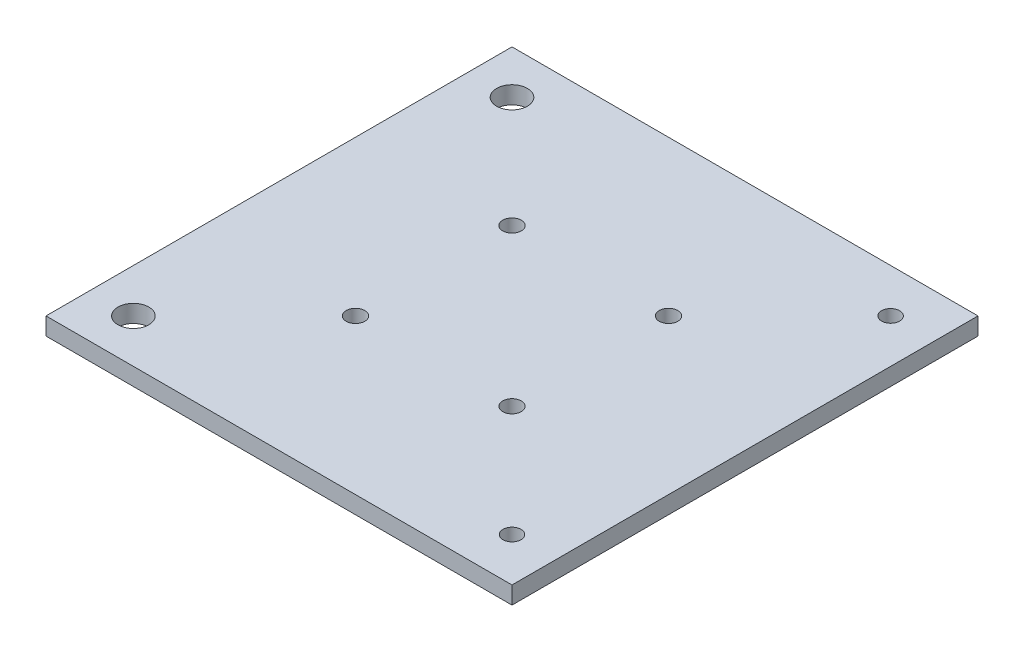
ISO-10303-21;
HEADER;
FILE_DESCRIPTION(('STEP AP214'),'2;1');
FILE_NAME('part.step','',(''),(''),'','','');
FILE_SCHEMA(('AUTOMOTIVE_DESIGN { 1 0 10303 214 1 1 1 1 }'));
ENDSEC;
DATA;
#1=APPLICATION_CONTEXT('core data for automotive mechanical design processes');
#2=APPLICATION_PROTOCOL_DEFINITION('international standard','automotive_design',2000,#1);
#3=PRODUCT_CONTEXT('',#1,'mechanical');
#4=PRODUCT('Part','Part','',(#3));
#5=PRODUCT_RELATED_PRODUCT_CATEGORY('part','',(#4));
#6=PRODUCT_DEFINITION_FORMATION('','',#4);
#7=PRODUCT_DEFINITION_CONTEXT('part definition',#1,'design');
#8=PRODUCT_DEFINITION('design','',#6,#7);
#9=PRODUCT_DEFINITION_SHAPE('','',#8);
#10=(LENGTH_UNIT() NAMED_UNIT(*) SI_UNIT(.MILLI.,.METRE.));
#11=(NAMED_UNIT(*) PLANE_ANGLE_UNIT() SI_UNIT($,.RADIAN.));
#12=(NAMED_UNIT(*) SI_UNIT($,.STERADIAN.) SOLID_ANGLE_UNIT());
#13=UNCERTAINTY_MEASURE_WITH_UNIT(LENGTH_MEASURE(1.E-05),#10,'distance_accuracy_value','');
#14=(GEOMETRIC_REPRESENTATION_CONTEXT(3) GLOBAL_UNCERTAINTY_ASSIGNED_CONTEXT((#13)) GLOBAL_UNIT_ASSIGNED_CONTEXT((#10,
#11,#12)) REPRESENTATION_CONTEXT('',''));
#15=CARTESIAN_POINT('',(0.,0.,0.));
#16=DIRECTION('',(0.,0.,1.));
#17=DIRECTION('',(1.,0.,0.));
#18=AXIS2_PLACEMENT_3D('',#15,#16,#17);
#19=CARTESIAN_POINT('',(0.,4.,40.));
#20=DIRECTION('',(0.,0.,-1.));
#21=DIRECTION('',(-1.,0.,0.));
#22=AXIS2_PLACEMENT_3D('',#19,#20,#21);
#23=PLANE('',#22);
#24=DIRECTION('',(-1.,0.,0.));
#25=VECTOR('',#24,1.);
#26=CARTESIAN_POINT('',(0.,1.,40.));
#27=LINE('',#26,#25);
#28=CARTESIAN_POINT('',(40.,1.,40.));
#29=VERTEX_POINT('',#28);
#30=CARTESIAN_POINT('',(-40.,1.,40.));
#31=VERTEX_POINT('',#30);
#32=EDGE_CURVE('E63',#29,#31,#27,.T.);
#33=ORIENTED_EDGE('',*,*,#32,.F.);
#34=DIRECTION('',(0.,-1.,0.));
#35=VECTOR('',#34,1.);
#36=CARTESIAN_POINT('',(40.,4.,40.));
#37=LINE('',#36,#35);
#38=CARTESIAN_POINT('',(40.,4.,40.));
#39=VERTEX_POINT('',#38);
#40=EDGE_CURVE('E11',#39,#29,#37,.T.);
#41=ORIENTED_EDGE('',*,*,#40,.F.);
#42=DIRECTION('',(1.,0.,0.));
#43=VECTOR('',#42,1.);
#44=CARTESIAN_POINT('',(0.,4.,40.));
#45=LINE('',#44,#43);
#46=CARTESIAN_POINT('',(-40.,4.,40.));
#47=VERTEX_POINT('',#46);
#48=EDGE_CURVE('E124',#47,#39,#45,.T.);
#49=ORIENTED_EDGE('',*,*,#48,.F.);
#50=DIRECTION('',(0.,-1.,0.));
#51=VECTOR('',#50,1.);
#52=CARTESIAN_POINT('',(-40.,4.,40.));
#53=LINE('',#52,#51);
#54=EDGE_CURVE('E70',#47,#31,#53,.T.);
#55=ORIENTED_EDGE('',*,*,#54,.T.);
#56=EDGE_LOOP('',(#33,#41,#49,#55));
#57=FACE_BOUND('',#56,.T.);
#58=ADVANCED_FACE('F46',(#57),#23,.F.);
#59=CARTESIAN_POINT('',(40.,4.,0.));
#60=DIRECTION('',(-1.,0.,0.));
#61=DIRECTION('',(0.,0.,1.));
#62=AXIS2_PLACEMENT_3D('',#59,#60,#61);
#63=PLANE('',#62);
#64=DIRECTION('',(0.,0.,1.));
#65=VECTOR('',#64,1.);
#66=CARTESIAN_POINT('',(40.,1.,0.));
#67=LINE('',#66,#65);
#68=CARTESIAN_POINT('',(40.,1.,-40.));
#69=VERTEX_POINT('',#68);
#70=EDGE_CURVE('E104',#69,#29,#67,.T.);
#71=ORIENTED_EDGE('',*,*,#70,.F.);
#72=DIRECTION('',(0.,-1.,0.));
#73=VECTOR('',#72,1.);
#74=CARTESIAN_POINT('',(40.,4.,-40.));
#75=LINE('',#74,#73);
#76=CARTESIAN_POINT('',(40.,4.,-40.));
#77=VERTEX_POINT('',#76);
#78=EDGE_CURVE('E56',#77,#69,#75,.T.);
#79=ORIENTED_EDGE('',*,*,#78,.F.);
#80=DIRECTION('',(0.,0.,-1.));
#81=VECTOR('',#80,1.);
#82=CARTESIAN_POINT('',(40.,4.,0.));
#83=LINE('',#82,#81);
#84=EDGE_CURVE('E121',#39,#77,#83,.T.);
#85=ORIENTED_EDGE('',*,*,#84,.F.);
#86=ORIENTED_EDGE('',*,*,#40,.T.);
#87=EDGE_LOOP('',(#71,#79,#85,#86));
#88=FACE_BOUND('',#87,.T.);
#89=ADVANCED_FACE('F215',(#88),#63,.F.);
#90=CARTESIAN_POINT('',(0.,4.,-40.));
#91=DIRECTION('',(0.,0.,-1.));
#92=DIRECTION('',(-1.,0.,0.));
#93=AXIS2_PLACEMENT_3D('',#90,#91,#92);
#94=PLANE('',#93);
#95=ORIENTED_EDGE('',*,*,#78,.T.);
#96=DIRECTION('',(-1.,0.,0.));
#97=VECTOR('',#96,1.);
#98=CARTESIAN_POINT('',(0.,1.,-40.));
#99=LINE('',#98,#97);
#100=CARTESIAN_POINT('',(-40.,1.,-40.));
#101=VERTEX_POINT('',#100);
#102=EDGE_CURVE('E90',#69,#101,#99,.T.);
#103=ORIENTED_EDGE('',*,*,#102,.T.);
#104=DIRECTION('',(0.,-1.,0.));
#105=VECTOR('',#104,1.);
#106=CARTESIAN_POINT('',(-40.,4.,-40.));
#107=LINE('',#106,#105);
#108=CARTESIAN_POINT('',(-40.,4.,-40.));
#109=VERTEX_POINT('',#108);
#110=EDGE_CURVE('E100',#109,#101,#107,.T.);
#111=ORIENTED_EDGE('',*,*,#110,.F.);
#112=DIRECTION('',(1.,0.,0.));
#113=VECTOR('',#112,1.);
#114=CARTESIAN_POINT('',(0.,4.,-40.));
#115=LINE('',#114,#113);
#116=EDGE_CURVE('E118',#109,#77,#115,.T.);
#117=ORIENTED_EDGE('',*,*,#116,.T.);
#118=EDGE_LOOP('',(#95,#103,#111,#117));
#119=FACE_BOUND('',#118,.T.);
#120=ADVANCED_FACE('F98',(#119),#94,.T.);
#121=CARTESIAN_POINT('',(-32.5,4.,32.5));
#122=DIRECTION('',(0.,-1.,0.));
#123=DIRECTION('',(0.,0.,-1.));
#124=AXIS2_PLACEMENT_3D('',#121,#122,#123);
#125=CYLINDRICAL_SURFACE('',#124,2.65);
#126=CARTESIAN_POINT('',(-32.5,4.,32.5));
#127=DIRECTION('',(0.,1.,0.));
#128=DIRECTION('',(0.,0.,1.));
#129=AXIS2_PLACEMENT_3D('',#126,#127,#128);
#130=CIRCLE('',#129,2.65);
#131=CARTESIAN_POINT('',(-32.5,4.,35.15));
#132=VERTEX_POINT('',#131);
#133=EDGE_CURVE('E128',#132,#132,#130,.T.);
#134=ORIENTED_EDGE('',*,*,#133,.T.);
#135=EDGE_LOOP('',(#134));
#136=FACE_BOUND('',#135,.T.);
#137=CARTESIAN_POINT('',(-32.5,1.,32.5));
#138=DIRECTION('',(0.,-1.,0.));
#139=DIRECTION('',(0.,0.,-1.));
#140=AXIS2_PLACEMENT_3D('',#137,#138,#139);
#141=CIRCLE('',#140,2.65);
#142=CARTESIAN_POINT('',(-32.5,1.,29.85));
#143=VERTEX_POINT('',#142);
#144=EDGE_CURVE('E154',#143,#143,#141,.T.);
#145=ORIENTED_EDGE('',*,*,#144,.T.);
#146=EDGE_LOOP('',(#145));
#147=FACE_BOUND('',#146,.T.);
#148=ADVANCED_FACE('F225',(#136,#147),#125,.F.);
#149=CARTESIAN_POINT('',(32.5,4.,-32.5));
#150=DIRECTION('',(0.,-1.,0.));
#151=DIRECTION('',(0.,0.,-1.));
#152=AXIS2_PLACEMENT_3D('',#149,#150,#151);
#153=CYLINDRICAL_SURFACE('',#152,1.55);
#154=CARTESIAN_POINT('',(32.5,4.,-32.5));
#155=DIRECTION('',(0.,1.,0.));
#156=DIRECTION('',(0.,0.,1.));
#157=AXIS2_PLACEMENT_3D('',#154,#155,#156);
#158=CIRCLE('',#157,1.55);
#159=CARTESIAN_POINT('',(32.5,4.,-30.95));
#160=VERTEX_POINT('',#159);
#161=EDGE_CURVE('E132',#160,#160,#158,.T.);
#162=ORIENTED_EDGE('',*,*,#161,.T.);
#163=EDGE_LOOP('',(#162));
#164=FACE_BOUND('',#163,.T.);
#165=CARTESIAN_POINT('',(32.5,1.,-32.5));
#166=DIRECTION('',(0.,-1.,0.));
#167=DIRECTION('',(0.,0.,-1.));
#168=AXIS2_PLACEMENT_3D('',#165,#166,#167);
#169=CIRCLE('',#168,1.55);
#170=CARTESIAN_POINT('',(32.5,1.,-34.05));
#171=VERTEX_POINT('',#170);
#172=EDGE_CURVE('E164',#171,#171,#169,.T.);
#173=ORIENTED_EDGE('',*,*,#172,.T.);
#174=EDGE_LOOP('',(#173));
#175=FACE_BOUND('',#174,.T.);
#176=ADVANCED_FACE('F228',(#164,#175),#153,.F.);
#177=CARTESIAN_POINT('',(-32.5,4.,-32.5));
#178=DIRECTION('',(0.,-1.,0.));
#179=DIRECTION('',(0.,0.,-1.));
#180=AXIS2_PLACEMENT_3D('',#177,#178,#179);
#181=CYLINDRICAL_SURFACE('',#180,2.65);
#182=CARTESIAN_POINT('',(-32.5,4.,-32.5));
#183=DIRECTION('',(0.,1.,0.));
#184=DIRECTION('',(0.,0.,1.));
#185=AXIS2_PLACEMENT_3D('',#182,#183,#184);
#186=CIRCLE('',#185,2.65);
#187=CARTESIAN_POINT('',(-32.5,4.,-29.85));
#188=VERTEX_POINT('',#187);
#189=EDGE_CURVE('E136',#188,#188,#186,.T.);
#190=ORIENTED_EDGE('',*,*,#189,.T.);
#191=EDGE_LOOP('',(#190));
#192=FACE_BOUND('',#191,.T.);
#193=CARTESIAN_POINT('',(-32.5,1.,-32.5));
#194=DIRECTION('',(0.,-1.,0.));
#195=DIRECTION('',(0.,0.,-1.));
#196=AXIS2_PLACEMENT_3D('',#193,#194,#195);
#197=CIRCLE('',#196,2.65);
#198=CARTESIAN_POINT('',(-32.5,1.,-35.15));
#199=VERTEX_POINT('',#198);
#200=EDGE_CURVE('E168',#199,#199,#197,.T.);
#201=ORIENTED_EDGE('',*,*,#200,.T.);
#202=EDGE_LOOP('',(#201));
#203=FACE_BOUND('',#202,.T.);
#204=ADVANCED_FACE('F231',(#192,#203),#181,.F.);
#205=CARTESIAN_POINT('',(32.5,4.,32.5));
#206=DIRECTION('',(0.,-1.,0.));
#207=DIRECTION('',(0.,0.,-1.));
#208=AXIS2_PLACEMENT_3D('',#205,#206,#207);
#209=CYLINDRICAL_SURFACE('',#208,1.55);
#210=CARTESIAN_POINT('',(32.5,4.,32.5));
#211=DIRECTION('',(0.,1.,0.));
#212=DIRECTION('',(0.,0.,1.));
#213=AXIS2_PLACEMENT_3D('',#210,#211,#212);
#214=CIRCLE('',#213,1.55);
#215=CARTESIAN_POINT('',(32.5,4.,34.05));
#216=VERTEX_POINT('',#215);
#217=EDGE_CURVE('E140',#216,#216,#214,.T.);
#218=ORIENTED_EDGE('',*,*,#217,.T.);
#219=EDGE_LOOP('',(#218));
#220=FACE_BOUND('',#219,.T.);
#221=CARTESIAN_POINT('',(32.5,1.,32.5));
#222=DIRECTION('',(0.,-1.,0.));
#223=DIRECTION('',(0.,0.,-1.));
#224=AXIS2_PLACEMENT_3D('',#221,#222,#223);
#225=CIRCLE('',#224,1.55);
#226=CARTESIAN_POINT('',(32.5,1.,30.95));
#227=VERTEX_POINT('',#226);
#228=EDGE_CURVE('E172',#227,#227,#225,.T.);
#229=ORIENTED_EDGE('',*,*,#228,.T.);
#230=EDGE_LOOP('',(#229));
#231=FACE_BOUND('',#230,.T.);
#232=ADVANCED_FACE('F48',(#220,#231),#209,.F.);
#233=CARTESIAN_POINT('',(-40.,4.,0.));
#234=DIRECTION('',(-1.,0.,0.));
#235=DIRECTION('',(0.,0.,1.));
#236=AXIS2_PLACEMENT_3D('',#233,#234,#235);
#237=PLANE('',#236);
#238=ORIENTED_EDGE('',*,*,#110,.T.);
#239=DIRECTION('',(0.,0.,1.));
#240=VECTOR('',#239,1.);
#241=CARTESIAN_POINT('',(-40.,1.,0.));
#242=LINE('',#241,#240);
#243=EDGE_CURVE('E87',#101,#31,#242,.T.);
#244=ORIENTED_EDGE('',*,*,#243,.T.);
#245=ORIENTED_EDGE('',*,*,#54,.F.);
#246=DIRECTION('',(0.,0.,-1.));
#247=VECTOR('',#246,1.);
#248=CARTESIAN_POINT('',(-40.,4.,0.));
#249=LINE('',#248,#247);
#250=EDGE_CURVE('E108',#47,#109,#249,.T.);
#251=ORIENTED_EDGE('',*,*,#250,.T.);
#252=EDGE_LOOP('',(#238,#244,#245,#251));
#253=FACE_BOUND('',#252,.T.);
#254=ADVANCED_FACE('F106',(#253),#237,.T.);
#255=CARTESIAN_POINT('',(-13.4350288425443,0.,-13.4350288425445));
#256=DIRECTION('',(0.,1.,0.));
#257=DIRECTION('',(0.,0.,1.));
#258=AXIS2_PLACEMENT_3D('',#255,#256,#257);
#259=CYLINDRICAL_SURFACE('',#258,1.6);
#260=CARTESIAN_POINT('',(-13.4350288425443,4.,-13.4350288425445));
#261=DIRECTION('',(0.,1.,0.));
#262=DIRECTION('',(0.,0.,1.));
#263=AXIS2_PLACEMENT_3D('',#260,#261,#262);
#264=CIRCLE('',#263,1.6);
#265=CARTESIAN_POINT('',(-13.4350288425443,4.,-11.8350288425445));
#266=VERTEX_POINT('',#265);
#267=EDGE_CURVE('E144',#266,#266,#264,.T.);
#268=ORIENTED_EDGE('',*,*,#267,.T.);
#269=EDGE_LOOP('',(#268));
#270=FACE_BOUND('',#269,.T.);
#271=CARTESIAN_POINT('',(-13.4350288425443,1.,-13.4350288425445));
#272=DIRECTION('',(0.,-1.,0.));
#273=DIRECTION('',(0.,0.,-1.));
#274=AXIS2_PLACEMENT_3D('',#271,#272,#273);
#275=CIRCLE('',#274,1.6);
#276=CARTESIAN_POINT('',(-13.4350288425443,1.,-15.0350288425445));
#277=VERTEX_POINT('',#276);
#278=EDGE_CURVE('E94',#277,#277,#275,.F.);
#279=ORIENTED_EDGE('',*,*,#278,.F.);
#280=EDGE_LOOP('',(#279));
#281=FACE_BOUND('',#280,.T.);
#282=ADVANCED_FACE('F253',(#270,#281),#259,.F.);
#283=CARTESIAN_POINT('',(-13.4350288425445,0.,13.4350288425443));
#284=DIRECTION('',(0.,1.,0.));
#285=DIRECTION('',(0.,0.,1.));
#286=AXIS2_PLACEMENT_3D('',#283,#284,#285);
#287=CYLINDRICAL_SURFACE('',#286,1.6);
#288=CARTESIAN_POINT('',(-13.4350288425445,4.,13.4350288425443));
#289=DIRECTION('',(0.,1.,0.));
#290=DIRECTION('',(0.,0.,1.));
#291=AXIS2_PLACEMENT_3D('',#288,#289,#290);
#292=CIRCLE('',#291,1.6);
#293=CARTESIAN_POINT('',(-13.4350288425445,4.,15.0350288425443));
#294=VERTEX_POINT('',#293);
#295=EDGE_CURVE('E148',#294,#294,#292,.T.);
#296=ORIENTED_EDGE('',*,*,#295,.T.);
#297=EDGE_LOOP('',(#296));
#298=FACE_BOUND('',#297,.T.);
#299=CARTESIAN_POINT('',(-13.4350288425445,1.,13.4350288425443));
#300=DIRECTION('',(0.,-1.,0.));
#301=DIRECTION('',(0.,0.,-1.));
#302=AXIS2_PLACEMENT_3D('',#299,#300,#301);
#303=CIRCLE('',#302,1.6);
#304=CARTESIAN_POINT('',(-13.4350288425445,1.,11.8350288425443));
#305=VERTEX_POINT('',#304);
#306=EDGE_CURVE('E183',#305,#305,#303,.F.);
#307=ORIENTED_EDGE('',*,*,#306,.F.);
#308=EDGE_LOOP('',(#307));
#309=FACE_BOUND('',#308,.T.);
#310=ADVANCED_FACE('F210',(#298,#309),#287,.F.);
#311=CARTESIAN_POINT('',(13.4350288425444,0.,13.4350288425444));
#312=DIRECTION('',(0.,1.,0.));
#313=DIRECTION('',(0.,0.,1.));
#314=AXIS2_PLACEMENT_3D('',#311,#312,#313);
#315=CYLINDRICAL_SURFACE('',#314,1.6);
#316=CARTESIAN_POINT('',(13.4350288425444,4.,13.4350288425444));
#317=DIRECTION('',(0.,1.,0.));
#318=DIRECTION('',(0.,0.,1.));
#319=AXIS2_PLACEMENT_3D('',#316,#317,#318);
#320=CIRCLE('',#319,1.6);
#321=CARTESIAN_POINT('',(13.4350288425444,4.,15.0350288425444));
#322=VERTEX_POINT('',#321);
#323=EDGE_CURVE('E153',#322,#322,#320,.T.);
#324=ORIENTED_EDGE('',*,*,#323,.T.);
#325=EDGE_LOOP('',(#324));
#326=FACE_BOUND('',#325,.T.);
#327=CARTESIAN_POINT('',(13.4350288425444,1.,13.4350288425444));
#328=DIRECTION('',(0.,-1.,0.));
#329=DIRECTION('',(0.,0.,-1.));
#330=AXIS2_PLACEMENT_3D('',#327,#328,#329);
#331=CIRCLE('',#330,1.6);
#332=CARTESIAN_POINT('',(13.4350288425444,1.,11.8350288425444));
#333=VERTEX_POINT('',#332);
#334=EDGE_CURVE('E187',#333,#333,#331,.F.);
#335=ORIENTED_EDGE('',*,*,#334,.F.);
#336=EDGE_LOOP('',(#335));
#337=FACE_BOUND('',#336,.T.);
#338=ADVANCED_FACE('F200',(#326,#337),#315,.F.);
#339=CARTESIAN_POINT('',(13.4350288425444,0.,-13.4350288425444));
#340=DIRECTION('',(0.,1.,0.));
#341=DIRECTION('',(0.,0.,1.));
#342=AXIS2_PLACEMENT_3D('',#339,#340,#341);
#343=CYLINDRICAL_SURFACE('',#342,1.6);
#344=CARTESIAN_POINT('',(13.4350288425444,4.,-13.4350288425444));
#345=DIRECTION('',(0.,1.,0.));
#346=DIRECTION('',(0.,0.,1.));
#347=AXIS2_PLACEMENT_3D('',#344,#345,#346);
#348=CIRCLE('',#347,1.6);
#349=CARTESIAN_POINT('',(13.4350288425444,4.,-11.8350288425444));
#350=VERTEX_POINT('',#349);
#351=EDGE_CURVE('E149',#350,#350,#348,.T.);
#352=ORIENTED_EDGE('',*,*,#351,.T.);
#353=EDGE_LOOP('',(#352));
#354=FACE_BOUND('',#353,.T.);
#355=CARTESIAN_POINT('',(13.4350288425444,1.,-13.4350288425444));
#356=DIRECTION('',(0.,-1.,0.));
#357=DIRECTION('',(0.,0.,-1.));
#358=AXIS2_PLACEMENT_3D('',#355,#356,#357);
#359=CIRCLE('',#358,1.6);
#360=CARTESIAN_POINT('',(13.4350288425444,1.,-15.0350288425444));
#361=VERTEX_POINT('',#360);
#362=EDGE_CURVE('E50',#361,#361,#359,.F.);
#363=ORIENTED_EDGE('',*,*,#362,.F.);
#364=EDGE_LOOP('',(#363));
#365=FACE_BOUND('',#364,.T.);
#366=ADVANCED_FACE('F197',(#354,#365),#343,.F.);
#367=CARTESIAN_POINT('',(0.,4.,0.));
#368=DIRECTION('',(0.,1.,0.));
#369=DIRECTION('',(0.,0.,1.));
#370=AXIS2_PLACEMENT_3D('',#367,#368,#369);
#371=PLANE('',#370);
#372=ORIENTED_EDGE('',*,*,#351,.F.);
#373=EDGE_LOOP('',(#372));
#374=FACE_BOUND('',#373,.T.);
#375=ORIENTED_EDGE('',*,*,#323,.F.);
#376=EDGE_LOOP('',(#375));
#377=FACE_BOUND('',#376,.T.);
#378=ORIENTED_EDGE('',*,*,#295,.F.);
#379=EDGE_LOOP('',(#378));
#380=FACE_BOUND('',#379,.T.);
#381=ORIENTED_EDGE('',*,*,#267,.F.);
#382=EDGE_LOOP('',(#381));
#383=FACE_BOUND('',#382,.T.);
#384=ORIENTED_EDGE('',*,*,#217,.F.);
#385=EDGE_LOOP('',(#384));
#386=FACE_BOUND('',#385,.T.);
#387=ORIENTED_EDGE('',*,*,#189,.F.);
#388=EDGE_LOOP('',(#387));
#389=FACE_BOUND('',#388,.T.);
#390=ORIENTED_EDGE('',*,*,#161,.F.);
#391=EDGE_LOOP('',(#390));
#392=FACE_BOUND('',#391,.T.);
#393=ORIENTED_EDGE('',*,*,#133,.F.);
#394=EDGE_LOOP('',(#393));
#395=FACE_BOUND('',#394,.T.);
#396=ORIENTED_EDGE('',*,*,#48,.T.);
#397=ORIENTED_EDGE('',*,*,#84,.T.);
#398=ORIENTED_EDGE('',*,*,#116,.F.);
#399=ORIENTED_EDGE('',*,*,#250,.F.);
#400=EDGE_LOOP('',(#396,#397,#398,#399));
#401=FACE_BOUND('',#400,.T.);
#402=ADVANCED_FACE('F199',(#374,#377,#380,#383,#386,#389,#392,#395,#401),#371,.T.);
#403=CARTESIAN_POINT('',(0.,1.,0.));
#404=DIRECTION('',(0.,-1.,0.));
#405=DIRECTION('',(0.,0.,-1.));
#406=AXIS2_PLACEMENT_3D('',#403,#404,#405);
#407=PLANE('',#406);
#408=ORIENTED_EDGE('',*,*,#144,.F.);
#409=EDGE_LOOP('',(#408));
#410=FACE_BOUND('',#409,.T.);
#411=ORIENTED_EDGE('',*,*,#172,.F.);
#412=EDGE_LOOP('',(#411));
#413=FACE_BOUND('',#412,.T.);
#414=ORIENTED_EDGE('',*,*,#200,.F.);
#415=EDGE_LOOP('',(#414));
#416=FACE_BOUND('',#415,.T.);
#417=ORIENTED_EDGE('',*,*,#228,.F.);
#418=EDGE_LOOP('',(#417));
#419=FACE_BOUND('',#418,.T.);
#420=ORIENTED_EDGE('',*,*,#278,.T.);
#421=EDGE_LOOP('',(#420));
#422=FACE_BOUND('',#421,.T.);
#423=ORIENTED_EDGE('',*,*,#306,.T.);
#424=EDGE_LOOP('',(#423));
#425=FACE_BOUND('',#424,.T.);
#426=ORIENTED_EDGE('',*,*,#334,.T.);
#427=EDGE_LOOP('',(#426));
#428=FACE_BOUND('',#427,.T.);
#429=ORIENTED_EDGE('',*,*,#362,.T.);
#430=EDGE_LOOP('',(#429));
#431=FACE_BOUND('',#430,.T.);
#432=ORIENTED_EDGE('',*,*,#32,.T.);
#433=ORIENTED_EDGE('',*,*,#243,.F.);
#434=ORIENTED_EDGE('',*,*,#102,.F.);
#435=ORIENTED_EDGE('',*,*,#70,.T.);
#436=EDGE_LOOP('',(#432,#433,#434,#435));
#437=FACE_BOUND('',#436,.T.);
#438=ADVANCED_FACE('F89',(#410,#413,#416,#419,#422,#425,#428,#431,#437),#407,.T.);
#439=CLOSED_SHELL('',(#58,#89,#120,#148,#176,#204,#232,#254,#282,#310,#338,#366,#402,#438));
#440=MANIFOLD_SOLID_BREP('B2',#439);
#441=ADVANCED_BREP_SHAPE_REPRESENTATION('',(#18,#440),#14);
#442=SHAPE_DEFINITION_REPRESENTATION(#9,#441);
ENDSEC;
END-ISO-10303-21;
